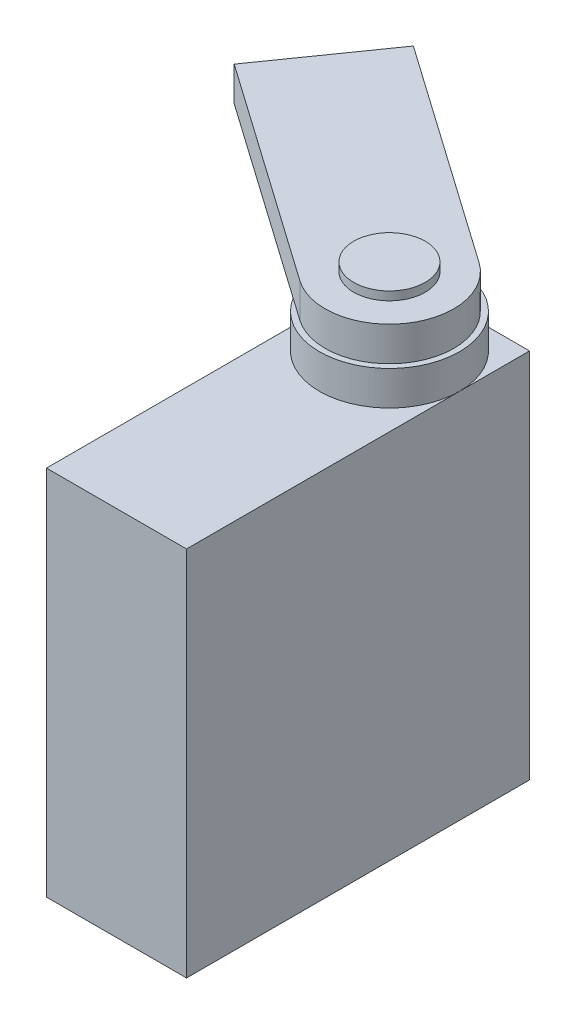
ISO-10303-21;
HEADER;
FILE_DESCRIPTION(('STEP AP214'),'2;1');
FILE_NAME('part.step','',(''),(''),'','','');
FILE_SCHEMA(('AUTOMOTIVE_DESIGN { 1 0 10303 214 1 1 1 1 }'));
ENDSEC;
DATA;
#1=APPLICATION_CONTEXT('core data for automotive mechanical design processes');
#2=APPLICATION_PROTOCOL_DEFINITION('international standard','automotive_design',2000,#1);
#3=PRODUCT_CONTEXT('',#1,'mechanical');
#4=PRODUCT('Part','Part','',(#3));
#5=PRODUCT_RELATED_PRODUCT_CATEGORY('part','',(#4));
#6=PRODUCT_DEFINITION_FORMATION('','',#4);
#7=PRODUCT_DEFINITION_CONTEXT('part definition',#1,'design');
#8=PRODUCT_DEFINITION('design','',#6,#7);
#9=PRODUCT_DEFINITION_SHAPE('','',#8);
#10=(LENGTH_UNIT() NAMED_UNIT(*) SI_UNIT(.MILLI.,.METRE.));
#11=(NAMED_UNIT(*) PLANE_ANGLE_UNIT() SI_UNIT($,.RADIAN.));
#12=(NAMED_UNIT(*) SI_UNIT($,.STERADIAN.) SOLID_ANGLE_UNIT());
#13=UNCERTAINTY_MEASURE_WITH_UNIT(LENGTH_MEASURE(1.E-05),#10,'distance_accuracy_value','');
#14=(GEOMETRIC_REPRESENTATION_CONTEXT(3) GLOBAL_UNCERTAINTY_ASSIGNED_CONTEXT((#13)) GLOBAL_UNIT_ASSIGNED_CONTEXT((#10,
#11,#12)) REPRESENTATION_CONTEXT('',''));
#15=CARTESIAN_POINT('',(0.,0.,0.));
#16=DIRECTION('',(0.,0.,1.));
#17=DIRECTION('',(1.,0.,0.));
#18=AXIS2_PLACEMENT_3D('',#15,#16,#17);
#19=CARTESIAN_POINT('',(6.223,36.068,6.223));
#20=DIRECTION('',(0.,1.,0.));
#21=DIRECTION('',(0.,0.,1.));
#22=AXIS2_PLACEMENT_3D('',#19,#20,#21);
#23=PLANE('',#22);
#24=CARTESIAN_POINT('',(6.223,36.068,6.223));
#25=DIRECTION('',(0.,1.,0.));
#26=DIRECTION('',(0.,0.,1.));
#27=AXIS2_PLACEMENT_3D('',#24,#25,#26);
#28=CIRCLE('',#27,6.223);
#29=CARTESIAN_POINT('',(0.923781735959218,36.068,9.48551663444903));
#30=VERTEX_POINT('',#29);
#31=CARTESIAN_POINT('',(7.49113073511609,36.068,0.130580658009998));
#32=VERTEX_POINT('',#31);
#33=EDGE_CURVE('E166',#30,#32,#28,.T.);
#34=ORIENTED_EDGE('',*,*,#33,.T.);
#35=DIRECTION('',(-0.818454591114526,0.,-0.574571216024223));
#36=VECTOR('',#35,1.);
#37=CARTESIAN_POINT('',(2.41165566928727,36.068,-3.4353107146118));
#38=LINE('',#37,#36);
#39=CARTESIAN_POINT('',(9.50667449957843,36.068,1.54553201178048));
#40=VERTEX_POINT('',#39);
#41=EDGE_CURVE('E249',#40,#32,#38,.T.);
#42=ORIENTED_EDGE('',*,*,#41,.F.);
#43=CARTESIAN_POINT('',(6.223,36.068,6.223));
#44=DIRECTION('',(0.,1.,0.));
#45=DIRECTION('',(0.,0.,1.));
#46=AXIS2_PLACEMENT_3D('',#43,#44,#45);
#47=CIRCLE('',#46,5.715);
#48=CARTESIAN_POINT('',(2.93932550042156,36.068,10.9004679882195));
#49=VERTEX_POINT('',#48);
#50=EDGE_CURVE('E150',#49,#40,#47,.T.);
#51=ORIENTED_EDGE('',*,*,#50,.F.);
#52=DIRECTION('',(0.818454591114526,0.,0.574571216024223));
#53=VECTOR('',#52,1.);
#54=CARTESIAN_POINT('',(-4.1556933298696,36.068,5.91962526182723));
#55=LINE('',#54,#53);
#56=EDGE_CURVE('E250',#30,#49,#55,.T.);
#57=ORIENTED_EDGE('',*,*,#56,.F.);
#58=EDGE_LOOP('',(#34,#42,#51,#57));
#59=FACE_BOUND('',#58,.T.);
#60=ADVANCED_FACE('F39',(#59),#23,.T.);
#61=CARTESIAN_POINT('',(0.,33.02,30.48));
#62=DIRECTION('',(0.,-1.,0.));
#63=DIRECTION('',(0.,0.,-1.));
#64=AXIS2_PLACEMENT_3D('',#61,#62,#63);
#65=PLANE('',#64);
#66=CARTESIAN_POINT('',(6.223,33.02,6.223));
#67=DIRECTION('',(0.,1.,0.));
#68=DIRECTION('',(0.,0.,1.));
#69=AXIS2_PLACEMENT_3D('',#66,#67,#68);
#70=CIRCLE('',#69,6.223);
#71=CARTESIAN_POINT('',(12.446,33.02,6.223));
#72=VERTEX_POINT('',#71);
#73=CARTESIAN_POINT('',(6.223,33.02,0.));
#74=VERTEX_POINT('',#73);
#75=EDGE_CURVE('E51',#72,#74,#70,.T.);
#76=ORIENTED_EDGE('',*,*,#75,.F.);
#77=DIRECTION('',(0.,0.,-1.));
#78=VECTOR('',#77,1.);
#79=CARTESIAN_POINT('',(12.446,33.02,30.48));
#80=LINE('',#79,#78);
#81=CARTESIAN_POINT('',(12.446,33.02,0.));
#82=VERTEX_POINT('',#81);
#83=EDGE_CURVE('E203',#72,#82,#80,.T.);
#84=ORIENTED_EDGE('',*,*,#83,.T.);
#85=DIRECTION('',(-1.,0.,0.));
#86=VECTOR('',#85,1.);
#87=CARTESIAN_POINT('',(0.,33.02,0.));
#88=LINE('',#87,#86);
#89=EDGE_CURVE('E175',#82,#74,#88,.T.);
#90=ORIENTED_EDGE('',*,*,#89,.T.);
#91=EDGE_LOOP('',(#76,#84,#90));
#92=FACE_BOUND('',#91,.T.);
#93=ADVANCED_FACE('F231',(#92),#65,.F.);
#94=CARTESIAN_POINT('',(0.,33.02,6.223));
#95=VERTEX_POINT('',#94);
#96=EDGE_CURVE('E11',#74,#95,#70,.T.);
#97=ORIENTED_EDGE('',*,*,#96,.F.);
#98=CARTESIAN_POINT('',(0.,33.02,0.));
#99=VERTEX_POINT('',#98);
#100=EDGE_CURVE('E195',#74,#99,#88,.T.);
#101=ORIENTED_EDGE('',*,*,#100,.T.);
#102=DIRECTION('',(0.,0.,-1.));
#103=VECTOR('',#102,1.);
#104=CARTESIAN_POINT('',(0.,33.02,30.48));
#105=LINE('',#104,#103);
#106=EDGE_CURVE('E184',#95,#99,#105,.T.);
#107=ORIENTED_EDGE('',*,*,#106,.F.);
#108=EDGE_LOOP('',(#97,#101,#107));
#109=FACE_BOUND('',#108,.T.);
#110=ADVANCED_FACE('F224',(#109),#65,.F.);
#111=CARTESIAN_POINT('',(0.,0.,30.48));
#112=DIRECTION('',(1.,0.,0.));
#113=DIRECTION('',(0.,0.,-1.));
#114=AXIS2_PLACEMENT_3D('',#111,#112,#113);
#115=PLANE('',#114);
#116=DIRECTION('',(0.,-1.,0.));
#117=VECTOR('',#116,1.);
#118=CARTESIAN_POINT('',(0.,0.,0.));
#119=LINE('',#118,#117);
#120=CARTESIAN_POINT('',(0.,0.,0.));
#121=VERTEX_POINT('',#120);
#122=EDGE_CURVE('E165',#99,#121,#119,.T.);
#123=ORIENTED_EDGE('',*,*,#122,.T.);
#124=DIRECTION('',(0.,0.,-1.));
#125=VECTOR('',#124,1.);
#126=CARTESIAN_POINT('',(0.,0.,30.48));
#127=LINE('',#126,#125);
#128=CARTESIAN_POINT('',(0.,0.,30.48));
#129=VERTEX_POINT('',#128);
#130=EDGE_CURVE('E43',#129,#121,#127,.T.);
#131=ORIENTED_EDGE('',*,*,#130,.F.);
#132=DIRECTION('',(0.,-1.,0.));
#133=VECTOR('',#132,1.);
#134=CARTESIAN_POINT('',(0.,0.,30.48));
#135=LINE('',#134,#133);
#136=CARTESIAN_POINT('',(0.,33.02,30.48));
#137=VERTEX_POINT('',#136);
#138=EDGE_CURVE('E170',#137,#129,#135,.T.);
#139=ORIENTED_EDGE('',*,*,#138,.F.);
#140=EDGE_CURVE('E199',#137,#95,#105,.T.);
#141=ORIENTED_EDGE('',*,*,#140,.T.);
#142=ORIENTED_EDGE('',*,*,#106,.T.);
#143=EDGE_LOOP('',(#123,#131,#139,#141,#142));
#144=FACE_BOUND('',#143,.T.);
#145=ADVANCED_FACE('F41',(#144),#115,.F.);
#146=CARTESIAN_POINT('',(0.,0.,30.48));
#147=DIRECTION('',(0.,1.,0.));
#148=DIRECTION('',(0.,0.,1.));
#149=AXIS2_PLACEMENT_3D('',#146,#147,#148);
#150=PLANE('',#149);
#151=DIRECTION('',(1.,0.,0.));
#152=VECTOR('',#151,1.);
#153=CARTESIAN_POINT('',(0.,0.,0.));
#154=LINE('',#153,#152);
#155=CARTESIAN_POINT('',(12.446,0.,0.));
#156=VERTEX_POINT('',#155);
#157=EDGE_CURVE('E188',#121,#156,#154,.T.);
#158=ORIENTED_EDGE('',*,*,#157,.T.);
#159=DIRECTION('',(0.,0.,-1.));
#160=VECTOR('',#159,1.);
#161=CARTESIAN_POINT('',(12.446,0.,30.48));
#162=LINE('',#161,#160);
#163=CARTESIAN_POINT('',(12.446,0.,30.48));
#164=VERTEX_POINT('',#163);
#165=EDGE_CURVE('E206',#164,#156,#162,.T.);
#166=ORIENTED_EDGE('',*,*,#165,.F.);
#167=DIRECTION('',(1.,0.,0.));
#168=VECTOR('',#167,1.);
#169=CARTESIAN_POINT('',(0.,0.,30.48));
#170=LINE('',#169,#168);
#171=EDGE_CURVE('E174',#129,#164,#170,.T.);
#172=ORIENTED_EDGE('',*,*,#171,.F.);
#173=ORIENTED_EDGE('',*,*,#130,.T.);
#174=EDGE_LOOP('',(#158,#166,#172,#173));
#175=FACE_BOUND('',#174,.T.);
#176=ADVANCED_FACE('F236',(#175),#150,.F.);
#177=CARTESIAN_POINT('',(12.446,0.,30.48));
#178=DIRECTION('',(-1.,0.,0.));
#179=DIRECTION('',(0.,-1.,0.));
#180=AXIS2_PLACEMENT_3D('',#177,#178,#179);
#181=PLANE('',#180);
#182=DIRECTION('',(0.,1.,0.));
#183=VECTOR('',#182,1.);
#184=CARTESIAN_POINT('',(12.446,0.,0.));
#185=LINE('',#184,#183);
#186=EDGE_CURVE('E191',#156,#82,#185,.T.);
#187=ORIENTED_EDGE('',*,*,#186,.T.);
#188=ORIENTED_EDGE('',*,*,#83,.F.);
#189=CARTESIAN_POINT('',(12.446,33.02,30.48));
#190=VERTEX_POINT('',#189);
#191=EDGE_CURVE('E204',#190,#72,#80,.T.);
#192=ORIENTED_EDGE('',*,*,#191,.F.);
#193=DIRECTION('',(0.,1.,0.));
#194=VECTOR('',#193,1.);
#195=CARTESIAN_POINT('',(12.446,0.,30.48));
#196=LINE('',#195,#194);
#197=EDGE_CURVE('E178',#164,#190,#196,.T.);
#198=ORIENTED_EDGE('',*,*,#197,.F.);
#199=ORIENTED_EDGE('',*,*,#165,.T.);
#200=EDGE_LOOP('',(#187,#188,#192,#198,#199));
#201=FACE_BOUND('',#200,.T.);
#202=ADVANCED_FACE('F235',(#201),#181,.F.);
#203=EDGE_CURVE('E49',#95,#72,#70,.T.);
#204=ORIENTED_EDGE('',*,*,#203,.F.);
#205=ORIENTED_EDGE('',*,*,#140,.F.);
#206=DIRECTION('',(-1.,0.,0.));
#207=VECTOR('',#206,1.);
#208=CARTESIAN_POINT('',(0.,33.02,30.48));
#209=LINE('',#208,#207);
#210=EDGE_CURVE('E181',#190,#137,#209,.T.);
#211=ORIENTED_EDGE('',*,*,#210,.F.);
#212=ORIENTED_EDGE('',*,*,#191,.T.);
#213=EDGE_LOOP('',(#204,#205,#211,#212));
#214=FACE_BOUND('',#213,.T.);
#215=ADVANCED_FACE('F303',(#214),#65,.F.);
#216=CARTESIAN_POINT('',(0.,0.,30.48));
#217=DIRECTION('',(0.,0.,-1.));
#218=DIRECTION('',(-1.,0.,0.));
#219=AXIS2_PLACEMENT_3D('',#216,#217,#218);
#220=PLANE('',#219);
#221=ORIENTED_EDGE('',*,*,#138,.T.);
#222=ORIENTED_EDGE('',*,*,#171,.T.);
#223=ORIENTED_EDGE('',*,*,#197,.T.);
#224=ORIENTED_EDGE('',*,*,#210,.T.);
#225=EDGE_LOOP('',(#221,#222,#223,#224));
#226=FACE_BOUND('',#225,.T.);
#227=ADVANCED_FACE('F239',(#226),#220,.F.);
#228=CARTESIAN_POINT('',(0.,0.,0.));
#229=DIRECTION('',(0.,0.,-1.));
#230=DIRECTION('',(-1.,0.,0.));
#231=AXIS2_PLACEMENT_3D('',#228,#229,#230);
#232=PLANE('',#231);
#233=ORIENTED_EDGE('',*,*,#122,.F.);
#234=ORIENTED_EDGE('',*,*,#100,.F.);
#235=ORIENTED_EDGE('',*,*,#89,.F.);
#236=ORIENTED_EDGE('',*,*,#186,.F.);
#237=ORIENTED_EDGE('',*,*,#157,.F.);
#238=EDGE_LOOP('',(#233,#234,#235,#236,#237));
#239=FACE_BOUND('',#238,.T.);
#240=ADVANCED_FACE('F228',(#239),#232,.T.);
#241=CARTESIAN_POINT('',(6.223,36.068,6.223));
#242=DIRECTION('',(0.,-1.,0.));
#243=DIRECTION('',(0.,0.,-1.));
#244=AXIS2_PLACEMENT_3D('',#241,#242,#243);
#245=CYLINDRICAL_SURFACE('',#244,6.223);
#246=EDGE_CURVE('E163',#32,#30,#28,.T.);
#247=ORIENTED_EDGE('',*,*,#246,.F.);
#248=ORIENTED_EDGE('',*,*,#33,.F.);
#249=EDGE_LOOP('',(#247,#248));
#250=FACE_BOUND('',#249,.T.);
#251=ORIENTED_EDGE('',*,*,#75,.T.);
#252=ORIENTED_EDGE('',*,*,#96,.T.);
#253=ORIENTED_EDGE('',*,*,#203,.T.);
#254=EDGE_LOOP('',(#251,#252,#253));
#255=FACE_BOUND('',#254,.T.);
#256=ADVANCED_FACE('F219',(#250,#255),#245,.T.);
#257=CARTESIAN_POINT('',(0.,36.068,0.));
#258=DIRECTION('',(0.,1.,0.));
#259=DIRECTION('',(0.,0.,1.));
#260=AXIS2_PLACEMENT_3D('',#257,#258,#259);
#261=PLANE('',#260);
#262=CARTESIAN_POINT('',(-10.0852831986079,36.068,-12.2084075239645));
#263=VERTEX_POINT('',#262);
#264=EDGE_CURVE('E255',#32,#263,#38,.T.);
#265=ORIENTED_EDGE('',*,*,#264,.F.);
#266=ORIENTED_EDGE('',*,*,#246,.T.);
#267=CARTESIAN_POINT('',(-16.6526321977648,36.068,-2.85347154752547));
#268=VERTEX_POINT('',#267);
#269=EDGE_CURVE('E58',#268,#30,#55,.T.);
#270=ORIENTED_EDGE('',*,*,#269,.F.);
#271=DIRECTION('',(-0.574571216024223,0.,0.818454591114526));
#272=VECTOR('',#271,1.);
#273=CARTESIAN_POINT('',(-12.4969388678952,36.068,-8.77309680935271));
#274=LINE('',#273,#272);
#275=EDGE_CURVE('E256',#263,#268,#274,.T.);
#276=ORIENTED_EDGE('',*,*,#275,.F.);
#277=EDGE_LOOP('',(#265,#266,#270,#276));
#278=FACE_BOUND('',#277,.T.);
#279=ADVANCED_FACE('F253',(#278),#261,.F.);
#280=CARTESIAN_POINT('',(6.223,39.116,6.223));
#281=DIRECTION('',(0.,-1.,0.));
#282=DIRECTION('',(0.,0.,-1.));
#283=AXIS2_PLACEMENT_3D('',#280,#281,#282);
#284=CYLINDRICAL_SURFACE('',#283,5.715);
#285=ORIENTED_EDGE('',*,*,#50,.T.);
#286=DIRECTION('',(0.,-1.,0.));
#287=VECTOR('',#286,1.);
#288=CARTESIAN_POINT('',(9.50667449957843,39.116,1.54553201178048));
#289=LINE('',#288,#287);
#290=CARTESIAN_POINT('',(9.50667449957843,39.116,1.54553201178048));
#291=VERTEX_POINT('',#290);
#292=EDGE_CURVE('E128',#291,#40,#289,.T.);
#293=ORIENTED_EDGE('',*,*,#292,.F.);
#294=CARTESIAN_POINT('',(6.223,39.116,6.223));
#295=DIRECTION('',(0.,1.,0.));
#296=DIRECTION('',(0.,0.,1.));
#297=AXIS2_PLACEMENT_3D('',#294,#295,#296);
#298=CIRCLE('',#297,5.715);
#299=CARTESIAN_POINT('',(2.93932550042156,39.116,10.9004679882195));
#300=VERTEX_POINT('',#299);
#301=EDGE_CURVE('E136',#300,#291,#298,.T.);
#302=ORIENTED_EDGE('',*,*,#301,.F.);
#303=DIRECTION('',(0.,-1.,0.));
#304=VECTOR('',#303,1.);
#305=CARTESIAN_POINT('',(2.93932550042156,39.116,10.9004679882195));
#306=LINE('',#305,#304);
#307=EDGE_CURVE('E267',#300,#49,#306,.T.);
#308=ORIENTED_EDGE('',*,*,#307,.T.);
#309=EDGE_LOOP('',(#285,#293,#302,#308));
#310=FACE_BOUND('',#309,.T.);
#311=ADVANCED_FACE('F148',(#310),#284,.T.);
#312=CARTESIAN_POINT('',(2.41165566928727,39.116,-3.4353107146118));
#313=DIRECTION('',(-0.574571216024223,0.,0.818454591114526));
#314=DIRECTION('',(0.818454591114526,0.,0.574571216024223));
#315=AXIS2_PLACEMENT_3D('',#312,#313,#314);
#316=PLANE('',#315);
#317=ORIENTED_EDGE('',*,*,#41,.T.);
#318=ORIENTED_EDGE('',*,*,#264,.T.);
#319=DIRECTION('',(0.,-1.,0.));
#320=VECTOR('',#319,1.);
#321=CARTESIAN_POINT('',(-10.0852831986079,39.116,-12.2084075239645));
#322=LINE('',#321,#320);
#323=CARTESIAN_POINT('',(-10.0852831986079,39.116,-12.2084075239645));
#324=VERTEX_POINT('',#323);
#325=EDGE_CURVE('E131',#324,#263,#322,.T.);
#326=ORIENTED_EDGE('',*,*,#325,.F.);
#327=DIRECTION('',(-0.818454591114526,0.,-0.574571216024223));
#328=VECTOR('',#327,1.);
#329=CARTESIAN_POINT('',(2.41165566928727,39.116,-3.4353107146118));
#330=LINE('',#329,#328);
#331=EDGE_CURVE('E123',#291,#324,#330,.T.);
#332=ORIENTED_EDGE('',*,*,#331,.F.);
#333=ORIENTED_EDGE('',*,*,#292,.T.);
#334=EDGE_LOOP('',(#317,#318,#326,#332,#333));
#335=FACE_BOUND('',#334,.T.);
#336=ADVANCED_FACE('F126',(#335),#316,.F.);
#337=CARTESIAN_POINT('',(-12.4969388678952,39.116,-8.77309680935271));
#338=DIRECTION('',(0.818454591114526,0.,0.574571216024223));
#339=DIRECTION('',(0.574571216024223,0.,-0.818454591114526));
#340=AXIS2_PLACEMENT_3D('',#337,#338,#339);
#341=PLANE('',#340);
#342=ORIENTED_EDGE('',*,*,#275,.T.);
#343=DIRECTION('',(0.,-1.,0.));
#344=VECTOR('',#343,1.);
#345=CARTESIAN_POINT('',(-16.6526321977648,39.116,-2.85347154752547));
#346=LINE('',#345,#344);
#347=CARTESIAN_POINT('',(-16.6526321977648,39.116,-2.85347154752547));
#348=VERTEX_POINT('',#347);
#349=EDGE_CURVE('E159',#348,#268,#346,.T.);
#350=ORIENTED_EDGE('',*,*,#349,.F.);
#351=DIRECTION('',(-0.574571216024223,0.,0.818454591114526));
#352=VECTOR('',#351,1.);
#353=CARTESIAN_POINT('',(-12.4969388678952,39.116,-8.77309680935271));
#354=LINE('',#353,#352);
#355=EDGE_CURVE('E135',#324,#348,#354,.T.);
#356=ORIENTED_EDGE('',*,*,#355,.F.);
#357=ORIENTED_EDGE('',*,*,#325,.T.);
#358=EDGE_LOOP('',(#342,#350,#356,#357));
#359=FACE_BOUND('',#358,.T.);
#360=ADVANCED_FACE('F273',(#359),#341,.F.);
#361=CARTESIAN_POINT('',(-4.1556933298696,39.116,5.91962526182723));
#362=DIRECTION('',(0.574571216024223,0.,-0.818454591114526));
#363=DIRECTION('',(-0.818454591114526,0.,-0.574571216024223));
#364=AXIS2_PLACEMENT_3D('',#361,#362,#363);
#365=PLANE('',#364);
#366=ORIENTED_EDGE('',*,*,#269,.T.);
#367=ORIENTED_EDGE('',*,*,#56,.T.);
#368=ORIENTED_EDGE('',*,*,#307,.F.);
#369=DIRECTION('',(0.818454591114526,0.,0.574571216024223));
#370=VECTOR('',#369,1.);
#371=CARTESIAN_POINT('',(-4.1556933298696,39.116,5.91962526182723));
#372=LINE('',#371,#370);
#373=EDGE_CURVE('E141',#348,#300,#372,.T.);
#374=ORIENTED_EDGE('',*,*,#373,.F.);
#375=ORIENTED_EDGE('',*,*,#349,.T.);
#376=EDGE_LOOP('',(#366,#367,#368,#374,#375));
#377=FACE_BOUND('',#376,.T.);
#378=ADVANCED_FACE('F271',(#377),#365,.F.);
#379=CARTESIAN_POINT('',(0.,39.116,0.));
#380=DIRECTION('',(0.,1.,0.));
#381=DIRECTION('',(0.,0.,1.));
#382=AXIS2_PLACEMENT_3D('',#379,#380,#381);
#383=PLANE('',#382);
#384=CARTESIAN_POINT('',(6.223,39.116,6.223));
#385=DIRECTION('',(0.,1.,0.));
#386=DIRECTION('',(0.,0.,1.));
#387=AXIS2_PLACEMENT_3D('',#384,#385,#386);
#388=CIRCLE('',#387,3.175);
#389=CARTESIAN_POINT('',(6.223,39.116,3.048));
#390=VERTEX_POINT('',#389);
#391=EDGE_CURVE('E146',#390,#390,#388,.F.);
#392=ORIENTED_EDGE('',*,*,#391,.T.);
#393=EDGE_LOOP('',(#392));
#394=FACE_BOUND('',#393,.T.);
#395=ORIENTED_EDGE('',*,*,#301,.T.);
#396=ORIENTED_EDGE('',*,*,#331,.T.);
#397=ORIENTED_EDGE('',*,*,#355,.T.);
#398=ORIENTED_EDGE('',*,*,#373,.T.);
#399=EDGE_LOOP('',(#395,#396,#397,#398));
#400=FACE_BOUND('',#399,.T.);
#401=ADVANCED_FACE('F139',(#394,#400),#383,.T.);
#402=CARTESIAN_POINT('',(6.223,39.878,6.223));
#403=DIRECTION('',(0.,1.,0.));
#404=DIRECTION('',(0.,0.,1.));
#405=AXIS2_PLACEMENT_3D('',#402,#403,#404);
#406=PLANE('',#405);
#407=CARTESIAN_POINT('',(6.223,39.878,6.223));
#408=DIRECTION('',(0.,1.,0.));
#409=DIRECTION('',(0.,0.,1.));
#410=AXIS2_PLACEMENT_3D('',#407,#408,#409);
#411=CIRCLE('',#410,3.175);
#412=CARTESIAN_POINT('',(6.223,39.878,3.048));
#413=VERTEX_POINT('',#412);
#414=EDGE_CURVE('E153',#413,#413,#411,.T.);
#415=ORIENTED_EDGE('',*,*,#414,.T.);
#416=EDGE_LOOP('',(#415));
#417=FACE_BOUND('',#416,.T.);
#418=ADVANCED_FACE('F286',(#417),#406,.T.);
#419=CARTESIAN_POINT('',(6.223,39.878,6.223));
#420=DIRECTION('',(0.,-1.,0.));
#421=DIRECTION('',(0.,0.,-1.));
#422=AXIS2_PLACEMENT_3D('',#419,#420,#421);
#423=CYLINDRICAL_SURFACE('',#422,3.175);
#424=CARTESIAN_POINT('',(6.223,39.116,3.048));
#425=CARTESIAN_POINT('',(6.223,39.1239375,3.048));
#426=CARTESIAN_POINT('',(6.223,39.131875,3.048));
#427=CARTESIAN_POINT('',(6.223,39.14775,3.048));
#428=CARTESIAN_POINT('',(6.223,39.1556875,3.048));
#429=CARTESIAN_POINT('',(6.223,39.1715625,3.048));
#430=CARTESIAN_POINT('',(6.223,39.1795,3.048));
#431=CARTESIAN_POINT('',(6.223,39.195375,3.048));
#432=CARTESIAN_POINT('',(6.223,39.2033125,3.048));
#433=CARTESIAN_POINT('',(6.223,39.2191875,3.048));
#434=CARTESIAN_POINT('',(6.223,39.227125,3.048));
#435=CARTESIAN_POINT('',(6.223,39.243,3.048));
#436=CARTESIAN_POINT('',(6.223,39.2509375,3.048));
#437=CARTESIAN_POINT('',(6.223,39.2668125,3.048));
#438=CARTESIAN_POINT('',(6.223,39.27475,3.048));
#439=CARTESIAN_POINT('',(6.223,39.290625,3.048));
#440=CARTESIAN_POINT('',(6.223,39.2985625,3.048));
#441=CARTESIAN_POINT('',(6.223,39.3144375,3.048));
#442=CARTESIAN_POINT('',(6.223,39.322375,3.048));
#443=CARTESIAN_POINT('',(6.223,39.33825,3.048));
#444=CARTESIAN_POINT('',(6.223,39.3461875,3.048));
#445=CARTESIAN_POINT('',(6.223,39.3620625,3.048));
#446=CARTESIAN_POINT('',(6.223,39.37,3.048));
#447=CARTESIAN_POINT('',(6.223,39.385875,3.048));
#448=CARTESIAN_POINT('',(6.223,39.3938125,3.048));
#449=CARTESIAN_POINT('',(6.223,39.4096875,3.048));
#450=CARTESIAN_POINT('',(6.223,39.417625,3.048));
#451=CARTESIAN_POINT('',(6.223,39.4335,3.048));
#452=CARTESIAN_POINT('',(6.223,39.4414375,3.048));
#453=CARTESIAN_POINT('',(6.223,39.4573125,3.048));
#454=CARTESIAN_POINT('',(6.223,39.46525,3.048));
#455=CARTESIAN_POINT('',(6.223,39.481125,3.048));
#456=CARTESIAN_POINT('',(6.223,39.4890625,3.048));
#457=CARTESIAN_POINT('',(6.223,39.5049375,3.048));
#458=CARTESIAN_POINT('',(6.223,39.512875,3.048));
#459=CARTESIAN_POINT('',(6.223,39.52875,3.048));
#460=CARTESIAN_POINT('',(6.223,39.5366875,3.048));
#461=CARTESIAN_POINT('',(6.223,39.5525625,3.048));
#462=CARTESIAN_POINT('',(6.223,39.5605,3.048));
#463=CARTESIAN_POINT('',(6.223,39.576375,3.048));
#464=CARTESIAN_POINT('',(6.223,39.5843125,3.048));
#465=CARTESIAN_POINT('',(6.223,39.6001875,3.048));
#466=CARTESIAN_POINT('',(6.223,39.608125,3.048));
#467=CARTESIAN_POINT('',(6.223,39.624,3.048));
#468=CARTESIAN_POINT('',(6.223,39.6319375,3.048));
#469=CARTESIAN_POINT('',(6.223,39.6478125,3.048));
#470=CARTESIAN_POINT('',(6.223,39.65575,3.048));
#471=CARTESIAN_POINT('',(6.223,39.671625,3.048));
#472=CARTESIAN_POINT('',(6.223,39.6795625,3.048));
#473=CARTESIAN_POINT('',(6.223,39.6954375,3.048));
#474=CARTESIAN_POINT('',(6.223,39.703375,3.048));
#475=CARTESIAN_POINT('',(6.223,39.71925,3.048));
#476=CARTESIAN_POINT('',(6.223,39.7271875,3.048));
#477=CARTESIAN_POINT('',(6.223,39.7430625,3.048));
#478=CARTESIAN_POINT('',(6.223,39.751,3.048));
#479=CARTESIAN_POINT('',(6.223,39.766875,3.048));
#480=CARTESIAN_POINT('',(6.223,39.7748125,3.048));
#481=CARTESIAN_POINT('',(6.223,39.7906875,3.048));
#482=CARTESIAN_POINT('',(6.223,39.798625,3.048));
#483=CARTESIAN_POINT('',(6.223,39.8145,3.048));
#484=CARTESIAN_POINT('',(6.223,39.8224375,3.048));
#485=CARTESIAN_POINT('',(6.223,39.8383125,3.048));
#486=CARTESIAN_POINT('',(6.223,39.84625,3.048));
#487=CARTESIAN_POINT('',(6.223,39.862125,3.048));
#488=CARTESIAN_POINT('',(6.223,39.8700625,3.048));
#489=CARTESIAN_POINT('',(6.223,39.878,3.048));
#490=B_SPLINE_CURVE_WITH_KNOTS('',3,(#424,#425,#426,#427,#428,#429,#430,#431,#432,#433,#434,
#435,#436,#437,#438,#439,#440,#441,#442,#443,#444,#445,#446,#447,#448,#449,#450,#451,#452,#453,
#454,#455,#456,#457,#458,#459,#460,#461,#462,#463,#464,#465,#466,#467,#468,#469,#470,#471,#472,
#473,#474,#475,#476,#477,#478,#479,#480,#481,#482,#483,#484,#485,#486,#487,#488,#489),
.UNSPECIFIED.,.F.,.F.,(4,2,2,2,2,2,2,2,2,2,2,2,2,2,2,2,2,2,2,2,2,2,2,2,2,2,2,2,2,2,2,2,4),(0.,
0.0238124999999978,0.0476249999999956,0.0714374999999934,0.0952499999999981,0.119062499999996,
0.142874999999994,0.166687499999998,0.190499999999996,0.214312499999994,0.238124999999999,
0.261937499999997,0.285749999999994,0.309562499999999,0.333374999999997,0.357187499999995,
0.380999999999999,0.404812499999997,0.428624999999995,0.452437499999993,0.476249999999998,
0.500062499999995,0.523874999999993,0.547687499999998,0.571499999999996,0.595312499999993,
0.619124999999998,0.642937499999996,0.666749999999994,0.690562499999998,0.714374999999996,
0.738187499999994,0.761999999999999),.UNSPECIFIED.);
#491=EDGE_CURVE('BSEAM283',#390,#413,#490,.T.);
#492=ORIENTED_EDGE('',*,*,#391,.F.);
#493=ORIENTED_EDGE('',*,*,#414,.F.);
#494=ORIENTED_EDGE('',*,*,#491,.T.);
#495=ORIENTED_EDGE('',*,*,#491,.F.);
#496=EDGE_LOOP('',(#492,#494,#493,#495));
#497=FACE_BOUND('',#496,.T.);
#498=ADVANCED_FACE('F283',(#497),#423,.T.);
#499=CLOSED_SHELL('',(#60,#93,#110,#145,#176,#202,#215,#227,#240,#256,#279,#311,#336,#360,#378,
#401,#418,#498));
#500=MANIFOLD_SOLID_BREP('B2',#499);
#501=ADVANCED_BREP_SHAPE_REPRESENTATION('',(#18,#500),#14);
#502=SHAPE_DEFINITION_REPRESENTATION(#9,#501);
ENDSEC;
END-ISO-10303-21;
